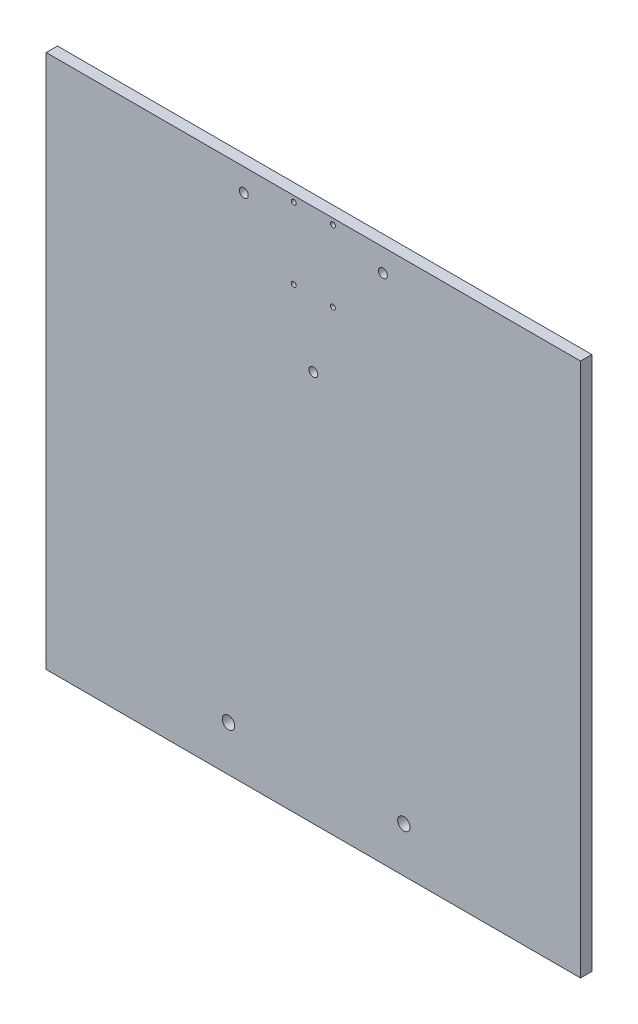
ISO-10303-21;
HEADER;
FILE_DESCRIPTION(('STEP AP214'),'2;1');
FILE_NAME('part.step','',(''),(''),'','','');
FILE_SCHEMA(('AUTOMOTIVE_DESIGN { 1 0 10303 214 1 1 1 1 }'));
ENDSEC;
DATA;
#1=APPLICATION_CONTEXT('core data for automotive mechanical design processes');
#2=APPLICATION_PROTOCOL_DEFINITION('international standard','automotive_design',2000,#1);
#3=PRODUCT_CONTEXT('',#1,'mechanical');
#4=PRODUCT('Part','Part','',(#3));
#5=PRODUCT_RELATED_PRODUCT_CATEGORY('part','',(#4));
#6=PRODUCT_DEFINITION_FORMATION('','',#4);
#7=PRODUCT_DEFINITION_CONTEXT('part definition',#1,'design');
#8=PRODUCT_DEFINITION('design','',#6,#7);
#9=PRODUCT_DEFINITION_SHAPE('','',#8);
#10=(LENGTH_UNIT() NAMED_UNIT(*) SI_UNIT(.MILLI.,.METRE.));
#11=(NAMED_UNIT(*) PLANE_ANGLE_UNIT() SI_UNIT($,.RADIAN.));
#12=(NAMED_UNIT(*) SI_UNIT($,.STERADIAN.) SOLID_ANGLE_UNIT());
#13=UNCERTAINTY_MEASURE_WITH_UNIT(LENGTH_MEASURE(1.E-05),#10,'distance_accuracy_value','');
#14=(GEOMETRIC_REPRESENTATION_CONTEXT(3) GLOBAL_UNCERTAINTY_ASSIGNED_CONTEXT((#13)) GLOBAL_UNIT_ASSIGNED_CONTEXT((#10,
#11,#12)) REPRESENTATION_CONTEXT('',''));
#15=CARTESIAN_POINT('',(0.,0.,0.));
#16=DIRECTION('',(0.,0.,1.));
#17=DIRECTION('',(1.,0.,0.));
#18=AXIS2_PLACEMENT_3D('',#15,#16,#17);
#19=CARTESIAN_POINT('',(0.,0.,6.35));
#20=DIRECTION('',(1.,0.,0.));
#21=DIRECTION('',(0.,1.,0.));
#22=AXIS2_PLACEMENT_3D('',#19,#20,#21);
#23=PLANE('',#22);
#24=DIRECTION('',(0.,-1.,0.));
#25=VECTOR('',#24,1.);
#26=CARTESIAN_POINT('',(0.,0.,0.));
#27=LINE('',#26,#25);
#28=CARTESIAN_POINT('',(0.,0.,0.));
#29=VERTEX_POINT('',#28);
#30=CARTESIAN_POINT('',(0.,-299.974,0.));
#31=VERTEX_POINT('',#30);
#32=EDGE_CURVE('E96',#29,#31,#27,.T.);
#33=ORIENTED_EDGE('',*,*,#32,.T.);
#34=DIRECTION('',(0.,0.,-1.));
#35=VECTOR('',#34,1.);
#36=CARTESIAN_POINT('',(0.,-299.974,6.35));
#37=LINE('',#36,#35);
#38=CARTESIAN_POINT('',(0.,-299.974,6.35));
#39=VERTEX_POINT('',#38);
#40=EDGE_CURVE('E11',#39,#31,#37,.T.);
#41=ORIENTED_EDGE('',*,*,#40,.F.);
#42=DIRECTION('',(0.,-1.,0.));
#43=VECTOR('',#42,1.);
#44=CARTESIAN_POINT('',(0.,0.,6.35));
#45=LINE('',#44,#43);
#46=CARTESIAN_POINT('',(0.,0.,6.35));
#47=VERTEX_POINT('',#46);
#48=EDGE_CURVE('E82',#47,#39,#45,.T.);
#49=ORIENTED_EDGE('',*,*,#48,.F.);
#50=DIRECTION('',(0.,0.,-1.));
#51=VECTOR('',#50,1.);
#52=CARTESIAN_POINT('',(0.,0.,6.35));
#53=LINE('',#52,#51);
#54=EDGE_CURVE('E49',#47,#29,#53,.T.);
#55=ORIENTED_EDGE('',*,*,#54,.T.);
#56=EDGE_LOOP('',(#33,#41,#49,#55));
#57=FACE_BOUND('',#56,.T.);
#58=ADVANCED_FACE('F33',(#57),#23,.F.);
#59=CARTESIAN_POINT('',(0.,-299.974,6.35));
#60=DIRECTION('',(0.,1.,0.));
#61=DIRECTION('',(0.,0.,1.));
#62=AXIS2_PLACEMENT_3D('',#59,#60,#61);
#63=PLANE('',#62);
#64=DIRECTION('',(1.,0.,0.));
#65=VECTOR('',#64,1.);
#66=CARTESIAN_POINT('',(0.,-299.974,0.));
#67=LINE('',#66,#65);
#68=CARTESIAN_POINT('',(299.974,-299.974,0.));
#69=VERTEX_POINT('',#68);
#70=EDGE_CURVE('E87',#31,#69,#67,.T.);
#71=ORIENTED_EDGE('',*,*,#70,.T.);
#72=DIRECTION('',(0.,0.,-1.));
#73=VECTOR('',#72,1.);
#74=CARTESIAN_POINT('',(299.974,-299.974,6.35));
#75=LINE('',#74,#73);
#76=CARTESIAN_POINT('',(299.974,-299.974,6.35));
#77=VERTEX_POINT('',#76);
#78=EDGE_CURVE('E41',#77,#69,#75,.T.);
#79=ORIENTED_EDGE('',*,*,#78,.F.);
#80=DIRECTION('',(1.,0.,0.));
#81=VECTOR('',#80,1.);
#82=CARTESIAN_POINT('',(0.,-299.974,6.35));
#83=LINE('',#82,#81);
#84=EDGE_CURVE('E74',#39,#77,#83,.T.);
#85=ORIENTED_EDGE('',*,*,#84,.F.);
#86=ORIENTED_EDGE('',*,*,#40,.T.);
#87=EDGE_LOOP('',(#71,#79,#85,#86));
#88=FACE_BOUND('',#87,.T.);
#89=ADVANCED_FACE('F86',(#88),#63,.F.);
#90=CARTESIAN_POINT('',(299.974,0.,6.35));
#91=DIRECTION('',(1.,0.,0.));
#92=DIRECTION('',(0.,1.,0.));
#93=AXIS2_PLACEMENT_3D('',#90,#91,#92);
#94=PLANE('',#93);
#95=DIRECTION('',(0.,-1.,0.));
#96=VECTOR('',#95,1.);
#97=CARTESIAN_POINT('',(299.974,0.,0.));
#98=LINE('',#97,#96);
#99=CARTESIAN_POINT('',(299.974,0.,0.));
#100=VERTEX_POINT('',#99);
#101=EDGE_CURVE('E100',#100,#69,#98,.T.);
#102=ORIENTED_EDGE('',*,*,#101,.F.);
#103=DIRECTION('',(0.,0.,-1.));
#104=VECTOR('',#103,1.);
#105=CARTESIAN_POINT('',(299.974,0.,6.35));
#106=LINE('',#105,#104);
#107=CARTESIAN_POINT('',(299.974,0.,6.35));
#108=VERTEX_POINT('',#107);
#109=EDGE_CURVE('E63',#108,#100,#106,.T.);
#110=ORIENTED_EDGE('',*,*,#109,.F.);
#111=DIRECTION('',(0.,-1.,0.));
#112=VECTOR('',#111,1.);
#113=CARTESIAN_POINT('',(299.974,0.,6.35));
#114=LINE('',#113,#112);
#115=EDGE_CURVE('E81',#108,#77,#114,.T.);
#116=ORIENTED_EDGE('',*,*,#115,.T.);
#117=ORIENTED_EDGE('',*,*,#78,.T.);
#118=EDGE_LOOP('',(#102,#110,#116,#117));
#119=FACE_BOUND('',#118,.T.);
#120=ADVANCED_FACE('F90',(#119),#94,.T.);
#121=CARTESIAN_POINT('',(0.,0.,6.35));
#122=DIRECTION('',(0.,1.,0.));
#123=DIRECTION('',(0.,0.,1.));
#124=AXIS2_PLACEMENT_3D('',#121,#122,#123);
#125=PLANE('',#124);
#126=DIRECTION('',(1.,0.,0.));
#127=VECTOR('',#126,1.);
#128=CARTESIAN_POINT('',(0.,0.,0.));
#129=LINE('',#128,#127);
#130=EDGE_CURVE('E102',#29,#100,#129,.T.);
#131=ORIENTED_EDGE('',*,*,#130,.F.);
#132=ORIENTED_EDGE('',*,*,#54,.F.);
#133=DIRECTION('',(1.,0.,0.));
#134=VECTOR('',#133,1.);
#135=CARTESIAN_POINT('',(0.,0.,6.35));
#136=LINE('',#135,#134);
#137=EDGE_CURVE('E91',#47,#108,#136,.T.);
#138=ORIENTED_EDGE('',*,*,#137,.T.);
#139=ORIENTED_EDGE('',*,*,#109,.T.);
#140=EDGE_LOOP('',(#131,#132,#138,#139));
#141=FACE_BOUND('',#140,.T.);
#142=ADVANCED_FACE('F174',(#141),#125,.T.);
#143=CARTESIAN_POINT('',(0.,0.,6.35));
#144=DIRECTION('',(0.,0.,1.));
#145=DIRECTION('',(1.,0.,0.));
#146=AXIS2_PLACEMENT_3D('',#143,#144,#145);
#147=PLANE('',#146);
#148=CARTESIAN_POINT('',(200.787,-274.574,6.35));
#149=DIRECTION('',(0.,0.,1.));
#150=DIRECTION('',(1.,0.,0.));
#151=AXIS2_PLACEMENT_3D('',#148,#149,#150);
#152=CIRCLE('',#151,3.49250000000001);
#153=CARTESIAN_POINT('',(204.2795,-274.574,6.35));
#154=VERTEX_POINT('',#153);
#155=EDGE_CURVE('E156',#154,#154,#152,.T.);
#156=ORIENTED_EDGE('',*,*,#155,.F.);
#157=EDGE_LOOP('',(#156));
#158=FACE_BOUND('',#157,.T.);
#159=CARTESIAN_POINT('',(102.362,-274.574,6.35));
#160=DIRECTION('',(0.,0.,1.));
#161=DIRECTION('',(1.,0.,0.));
#162=AXIS2_PLACEMENT_3D('',#159,#160,#161);
#163=CIRCLE('',#162,3.4925);
#164=CARTESIAN_POINT('',(105.8545,-274.574,6.35));
#165=VERTEX_POINT('',#164);
#166=EDGE_CURVE('E150',#165,#165,#163,.T.);
#167=ORIENTED_EDGE('',*,*,#166,.F.);
#168=EDGE_LOOP('',(#167));
#169=FACE_BOUND('',#168,.T.);
#170=CARTESIAN_POINT('',(189.031549178925,-12.7076190211604,6.35));
#171=DIRECTION('',(0.,0.,-1.));
#172=DIRECTION('',(-1.,0.,0.));
#173=AXIS2_PLACEMENT_3D('',#170,#171,#172);
#174=CIRCLE('',#173,2.5);
#175=CARTESIAN_POINT('',(186.531549178925,-12.7076190211604,6.35));
#176=VERTEX_POINT('',#175);
#177=EDGE_CURVE('E118',#176,#176,#174,.T.);
#178=ORIENTED_EDGE('',*,*,#177,.T.);
#179=EDGE_LOOP('',(#178));
#180=FACE_BOUND('',#179,.T.);
#181=CARTESIAN_POINT('',(110.942450821075,-12.7076190211599,6.35));
#182=DIRECTION('',(0.,0.,-1.));
#183=DIRECTION('',(-1.,0.,0.));
#184=AXIS2_PLACEMENT_3D('',#181,#182,#183);
#185=CIRCLE('',#184,2.5);
#186=CARTESIAN_POINT('',(108.442450821075,-12.7076190211599,6.35));
#187=VERTEX_POINT('',#186);
#188=EDGE_CURVE('E142',#187,#187,#185,.T.);
#189=ORIENTED_EDGE('',*,*,#188,.T.);
#190=EDGE_LOOP('',(#189));
#191=FACE_BOUND('',#190,.T.);
#192=CARTESIAN_POINT('',(149.987,-80.3347619576797,6.35));
#193=DIRECTION('',(0.,0.,-1.));
#194=DIRECTION('',(-1.,0.,0.));
#195=AXIS2_PLACEMENT_3D('',#192,#193,#194);
#196=CIRCLE('',#195,2.5);
#197=CARTESIAN_POINT('',(147.487,-80.3347619576797,6.35));
#198=VERTEX_POINT('',#197);
#199=EDGE_CURVE('E135',#198,#198,#196,.T.);
#200=ORIENTED_EDGE('',*,*,#199,.T.);
#201=EDGE_LOOP('',(#200));
#202=FACE_BOUND('',#201,.T.);
#203=CARTESIAN_POINT('',(160.987,-43.25,6.35));
#204=DIRECTION('',(0.,0.,-1.));
#205=DIRECTION('',(-1.,0.,0.));
#206=AXIS2_PLACEMENT_3D('',#203,#204,#205);
#207=CIRCLE('',#206,1.37499999999999);
#208=CARTESIAN_POINT('',(159.612,-43.25,6.35));
#209=VERTEX_POINT('',#208);
#210=EDGE_CURVE('E117',#209,#209,#207,.T.);
#211=ORIENTED_EDGE('',*,*,#210,.T.);
#212=EDGE_LOOP('',(#211));
#213=FACE_BOUND('',#212,.T.);
#214=CARTESIAN_POINT('',(138.987,-43.25,6.35));
#215=DIRECTION('',(0.,0.,-1.));
#216=DIRECTION('',(-1.,0.,0.));
#217=AXIS2_PLACEMENT_3D('',#214,#215,#216);
#218=CIRCLE('',#217,1.37499999999999);
#219=CARTESIAN_POINT('',(137.612,-43.25,6.35));
#220=VERTEX_POINT('',#219);
#221=EDGE_CURVE('E124',#220,#220,#218,.T.);
#222=ORIENTED_EDGE('',*,*,#221,.T.);
#223=EDGE_LOOP('',(#222));
#224=FACE_BOUND('',#223,.T.);
#225=CARTESIAN_POINT('',(138.987,-3.25,6.35));
#226=DIRECTION('',(0.,0.,-1.));
#227=DIRECTION('',(-1.,0.,0.));
#228=AXIS2_PLACEMENT_3D('',#225,#226,#227);
#229=CIRCLE('',#228,1.37499999999999);
#230=CARTESIAN_POINT('',(137.612,-3.25,6.35));
#231=VERTEX_POINT('',#230);
#232=EDGE_CURVE('E111',#231,#231,#229,.T.);
#233=ORIENTED_EDGE('',*,*,#232,.T.);
#234=EDGE_LOOP('',(#233));
#235=FACE_BOUND('',#234,.T.);
#236=CARTESIAN_POINT('',(160.987,-3.25,6.35));
#237=DIRECTION('',(0.,0.,-1.));
#238=DIRECTION('',(-1.,0.,0.));
#239=AXIS2_PLACEMENT_3D('',#236,#237,#238);
#240=CIRCLE('',#239,1.37499999999999);
#241=CARTESIAN_POINT('',(159.612,-3.25,6.35));
#242=VERTEX_POINT('',#241);
#243=EDGE_CURVE('E98',#242,#242,#240,.T.);
#244=ORIENTED_EDGE('',*,*,#243,.T.);
#245=EDGE_LOOP('',(#244));
#246=FACE_BOUND('',#245,.T.);
#247=ORIENTED_EDGE('',*,*,#48,.T.);
#248=ORIENTED_EDGE('',*,*,#84,.T.);
#249=ORIENTED_EDGE('',*,*,#115,.F.);
#250=ORIENTED_EDGE('',*,*,#137,.F.);
#251=EDGE_LOOP('',(#247,#248,#249,#250));
#252=FACE_BOUND('',#251,.T.);
#253=ADVANCED_FACE('F78',(#158,#169,#180,#191,#202,#213,#224,#235,#246,#252),#147,.T.);
#254=CARTESIAN_POINT('',(0.,0.,0.));
#255=DIRECTION('',(0.,0.,1.));
#256=DIRECTION('',(1.,0.,0.));
#257=AXIS2_PLACEMENT_3D('',#254,#255,#256);
#258=PLANE('',#257);
#259=CARTESIAN_POINT('',(200.787,-274.574,0.));
#260=DIRECTION('',(0.,0.,1.));
#261=DIRECTION('',(1.,0.,0.));
#262=AXIS2_PLACEMENT_3D('',#259,#260,#261);
#263=CIRCLE('',#262,3.49250000000001);
#264=CARTESIAN_POINT('',(204.2795,-274.574,0.));
#265=VERTEX_POINT('',#264);
#266=EDGE_CURVE('E136',#265,#265,#263,.T.);
#267=ORIENTED_EDGE('',*,*,#266,.T.);
#268=EDGE_LOOP('',(#267));
#269=FACE_BOUND('',#268,.T.);
#270=CARTESIAN_POINT('',(102.362,-274.574,0.));
#271=DIRECTION('',(0.,0.,1.));
#272=DIRECTION('',(1.,0.,0.));
#273=AXIS2_PLACEMENT_3D('',#270,#271,#272);
#274=CIRCLE('',#273,3.4925);
#275=CARTESIAN_POINT('',(105.8545,-274.574,0.));
#276=VERTEX_POINT('',#275);
#277=EDGE_CURVE('E153',#276,#276,#274,.T.);
#278=ORIENTED_EDGE('',*,*,#277,.T.);
#279=EDGE_LOOP('',(#278));
#280=FACE_BOUND('',#279,.T.);
#281=CARTESIAN_POINT('',(189.031549178925,-12.7076190211604,0.));
#282=DIRECTION('',(0.,0.,-1.));
#283=DIRECTION('',(-1.,0.,0.));
#284=AXIS2_PLACEMENT_3D('',#281,#282,#283);
#285=CIRCLE('',#284,2.5);
#286=CARTESIAN_POINT('',(186.531549178925,-12.7076190211604,0.));
#287=VERTEX_POINT('',#286);
#288=EDGE_CURVE('E145',#287,#287,#285,.T.);
#289=ORIENTED_EDGE('',*,*,#288,.F.);
#290=EDGE_LOOP('',(#289));
#291=FACE_BOUND('',#290,.T.);
#292=CARTESIAN_POINT('',(110.942450821075,-12.7076190211599,0.));
#293=DIRECTION('',(0.,0.,-1.));
#294=DIRECTION('',(-1.,0.,0.));
#295=AXIS2_PLACEMENT_3D('',#292,#293,#294);
#296=CIRCLE('',#295,2.5);
#297=CARTESIAN_POINT('',(108.442450821075,-12.7076190211599,0.));
#298=VERTEX_POINT('',#297);
#299=EDGE_CURVE('E139',#298,#298,#296,.T.);
#300=ORIENTED_EDGE('',*,*,#299,.F.);
#301=EDGE_LOOP('',(#300));
#302=FACE_BOUND('',#301,.T.);
#303=CARTESIAN_POINT('',(149.987,-80.3347619576797,0.));
#304=DIRECTION('',(0.,0.,-1.));
#305=DIRECTION('',(-1.,0.,0.));
#306=AXIS2_PLACEMENT_3D('',#303,#304,#305);
#307=CIRCLE('',#306,2.5);
#308=CARTESIAN_POINT('',(147.487,-80.3347619576797,0.));
#309=VERTEX_POINT('',#308);
#310=EDGE_CURVE('E132',#309,#309,#307,.T.);
#311=ORIENTED_EDGE('',*,*,#310,.F.);
#312=EDGE_LOOP('',(#311));
#313=FACE_BOUND('',#312,.T.);
#314=CARTESIAN_POINT('',(160.987,-43.25,0.));
#315=DIRECTION('',(0.,0.,-1.));
#316=DIRECTION('',(-1.,0.,0.));
#317=AXIS2_PLACEMENT_3D('',#314,#315,#316);
#318=CIRCLE('',#317,1.37499999999999);
#319=CARTESIAN_POINT('',(159.612,-43.25,0.));
#320=VERTEX_POINT('',#319);
#321=EDGE_CURVE('E114',#320,#320,#318,.T.);
#322=ORIENTED_EDGE('',*,*,#321,.F.);
#323=EDGE_LOOP('',(#322));
#324=FACE_BOUND('',#323,.T.);
#325=CARTESIAN_POINT('',(138.987,-43.25,0.));
#326=DIRECTION('',(0.,0.,-1.));
#327=DIRECTION('',(-1.,0.,0.));
#328=AXIS2_PLACEMENT_3D('',#325,#326,#327);
#329=CIRCLE('',#328,1.37499999999999);
#330=CARTESIAN_POINT('',(137.612,-43.25,0.));
#331=VERTEX_POINT('',#330);
#332=EDGE_CURVE('E121',#331,#331,#329,.T.);
#333=ORIENTED_EDGE('',*,*,#332,.F.);
#334=EDGE_LOOP('',(#333));
#335=FACE_BOUND('',#334,.T.);
#336=CARTESIAN_POINT('',(138.987,-3.25,0.));
#337=DIRECTION('',(0.,0.,-1.));
#338=DIRECTION('',(-1.,0.,0.));
#339=AXIS2_PLACEMENT_3D('',#336,#337,#338);
#340=CIRCLE('',#339,1.37499999999999);
#341=CARTESIAN_POINT('',(137.612,-3.25,0.));
#342=VERTEX_POINT('',#341);
#343=EDGE_CURVE('E127',#342,#342,#340,.T.);
#344=ORIENTED_EDGE('',*,*,#343,.F.);
#345=EDGE_LOOP('',(#344));
#346=FACE_BOUND('',#345,.T.);
#347=CARTESIAN_POINT('',(160.987,-3.25,0.));
#348=DIRECTION('',(0.,0.,-1.));
#349=DIRECTION('',(-1.,0.,0.));
#350=AXIS2_PLACEMENT_3D('',#347,#348,#349);
#351=CIRCLE('',#350,1.37499999999999);
#352=CARTESIAN_POINT('',(159.612,-3.25,0.));
#353=VERTEX_POINT('',#352);
#354=EDGE_CURVE('E108',#353,#353,#351,.T.);
#355=ORIENTED_EDGE('',*,*,#354,.F.);
#356=EDGE_LOOP('',(#355));
#357=FACE_BOUND('',#356,.T.);
#358=ORIENTED_EDGE('',*,*,#32,.F.);
#359=ORIENTED_EDGE('',*,*,#130,.T.);
#360=ORIENTED_EDGE('',*,*,#101,.T.);
#361=ORIENTED_EDGE('',*,*,#70,.F.);
#362=EDGE_LOOP('',(#358,#359,#360,#361));
#363=FACE_BOUND('',#362,.T.);
#364=ADVANCED_FACE('F162',(#269,#280,#291,#302,#313,#324,#335,#346,#357,#363),#258,.F.);
#365=CARTESIAN_POINT('',(160.987,-3.25,6.35));
#366=DIRECTION('',(0.,0.,-1.));
#367=DIRECTION('',(-1.,0.,0.));
#368=AXIS2_PLACEMENT_3D('',#365,#366,#367);
#369=CYLINDRICAL_SURFACE('',#368,1.37499999999999);
#370=ORIENTED_EDGE('',*,*,#243,.F.);
#371=EDGE_LOOP('',(#370));
#372=FACE_BOUND('',#371,.T.);
#373=ORIENTED_EDGE('',*,*,#354,.T.);
#374=EDGE_LOOP('',(#373));
#375=FACE_BOUND('',#374,.T.);
#376=ADVANCED_FACE('F192',(#372,#375),#369,.F.);
#377=CARTESIAN_POINT('',(138.987,-3.25,6.35));
#378=DIRECTION('',(0.,0.,-1.));
#379=DIRECTION('',(-1.,0.,0.));
#380=AXIS2_PLACEMENT_3D('',#377,#378,#379);
#381=CYLINDRICAL_SURFACE('',#380,1.37499999999999);
#382=ORIENTED_EDGE('',*,*,#232,.F.);
#383=EDGE_LOOP('',(#382));
#384=FACE_BOUND('',#383,.T.);
#385=ORIENTED_EDGE('',*,*,#343,.T.);
#386=EDGE_LOOP('',(#385));
#387=FACE_BOUND('',#386,.T.);
#388=ADVANCED_FACE('F195',(#384,#387),#381,.F.);
#389=CARTESIAN_POINT('',(138.987,-43.25,6.35));
#390=DIRECTION('',(0.,0.,-1.));
#391=DIRECTION('',(-1.,0.,0.));
#392=AXIS2_PLACEMENT_3D('',#389,#390,#391);
#393=CYLINDRICAL_SURFACE('',#392,1.37499999999999);
#394=ORIENTED_EDGE('',*,*,#221,.F.);
#395=EDGE_LOOP('',(#394));
#396=FACE_BOUND('',#395,.T.);
#397=ORIENTED_EDGE('',*,*,#332,.T.);
#398=EDGE_LOOP('',(#397));
#399=FACE_BOUND('',#398,.T.);
#400=ADVANCED_FACE('F238',(#396,#399),#393,.F.);
#401=CARTESIAN_POINT('',(160.987,-43.25,6.35));
#402=DIRECTION('',(0.,0.,-1.));
#403=DIRECTION('',(-1.,0.,0.));
#404=AXIS2_PLACEMENT_3D('',#401,#402,#403);
#405=CYLINDRICAL_SURFACE('',#404,1.37499999999999);
#406=ORIENTED_EDGE('',*,*,#210,.F.);
#407=EDGE_LOOP('',(#406));
#408=FACE_BOUND('',#407,.T.);
#409=ORIENTED_EDGE('',*,*,#321,.T.);
#410=EDGE_LOOP('',(#409));
#411=FACE_BOUND('',#410,.T.);
#412=ADVANCED_FACE('F248',(#408,#411),#405,.F.);
#413=CARTESIAN_POINT('',(149.987,-80.3347619576797,6.35));
#414=DIRECTION('',(0.,0.,-1.));
#415=DIRECTION('',(-1.,0.,0.));
#416=AXIS2_PLACEMENT_3D('',#413,#414,#415);
#417=CYLINDRICAL_SURFACE('',#416,2.5);
#418=ORIENTED_EDGE('',*,*,#199,.F.);
#419=EDGE_LOOP('',(#418));
#420=FACE_BOUND('',#419,.T.);
#421=ORIENTED_EDGE('',*,*,#310,.T.);
#422=EDGE_LOOP('',(#421));
#423=FACE_BOUND('',#422,.T.);
#424=ADVANCED_FACE('F258',(#420,#423),#417,.F.);
#425=CARTESIAN_POINT('',(110.942450821075,-12.7076190211599,6.35));
#426=DIRECTION('',(0.,0.,-1.));
#427=DIRECTION('',(-1.,0.,0.));
#428=AXIS2_PLACEMENT_3D('',#425,#426,#427);
#429=CYLINDRICAL_SURFACE('',#428,2.5);
#430=ORIENTED_EDGE('',*,*,#188,.F.);
#431=EDGE_LOOP('',(#430));
#432=FACE_BOUND('',#431,.T.);
#433=ORIENTED_EDGE('',*,*,#299,.T.);
#434=EDGE_LOOP('',(#433));
#435=FACE_BOUND('',#434,.T.);
#436=ADVANCED_FACE('F268',(#432,#435),#429,.F.);
#437=CARTESIAN_POINT('',(189.031549178925,-12.7076190211604,6.35));
#438=DIRECTION('',(0.,0.,-1.));
#439=DIRECTION('',(-1.,0.,0.));
#440=AXIS2_PLACEMENT_3D('',#437,#438,#439);
#441=CYLINDRICAL_SURFACE('',#440,2.5);
#442=ORIENTED_EDGE('',*,*,#177,.F.);
#443=EDGE_LOOP('',(#442));
#444=FACE_BOUND('',#443,.T.);
#445=ORIENTED_EDGE('',*,*,#288,.T.);
#446=EDGE_LOOP('',(#445));
#447=FACE_BOUND('',#446,.T.);
#448=ADVANCED_FACE('F278',(#444,#447),#441,.F.);
#449=CARTESIAN_POINT('',(102.362,-274.574,0.));
#450=DIRECTION('',(0.,0.,1.));
#451=DIRECTION('',(1.,0.,0.));
#452=AXIS2_PLACEMENT_3D('',#449,#450,#451);
#453=CYLINDRICAL_SURFACE('',#452,3.4925);
#454=ORIENTED_EDGE('',*,*,#277,.F.);
#455=EDGE_LOOP('',(#454));
#456=FACE_BOUND('',#455,.T.);
#457=ORIENTED_EDGE('',*,*,#166,.T.);
#458=EDGE_LOOP('',(#457));
#459=FACE_BOUND('',#458,.T.);
#460=ADVANCED_FACE('F168',(#456,#459),#453,.F.);
#461=CARTESIAN_POINT('',(200.787,-274.574,0.));
#462=DIRECTION('',(0.,0.,1.));
#463=DIRECTION('',(1.,0.,0.));
#464=AXIS2_PLACEMENT_3D('',#461,#462,#463);
#465=CYLINDRICAL_SURFACE('',#464,3.49250000000001);
#466=ORIENTED_EDGE('',*,*,#266,.F.);
#467=EDGE_LOOP('',(#466));
#468=FACE_BOUND('',#467,.T.);
#469=ORIENTED_EDGE('',*,*,#155,.T.);
#470=EDGE_LOOP('',(#469));
#471=FACE_BOUND('',#470,.T.);
#472=ADVANCED_FACE('F165',(#468,#471),#465,.F.);
#473=CLOSED_SHELL('',(#58,#89,#120,#142,#253,#364,#376,#388,#400,#412,#424,#436,#448,#460,#472));
#474=MANIFOLD_SOLID_BREP('B2',#473);
#475=ADVANCED_BREP_SHAPE_REPRESENTATION('',(#18,#474),#14);
#476=SHAPE_DEFINITION_REPRESENTATION(#9,#475);
ENDSEC;
END-ISO-10303-21;
